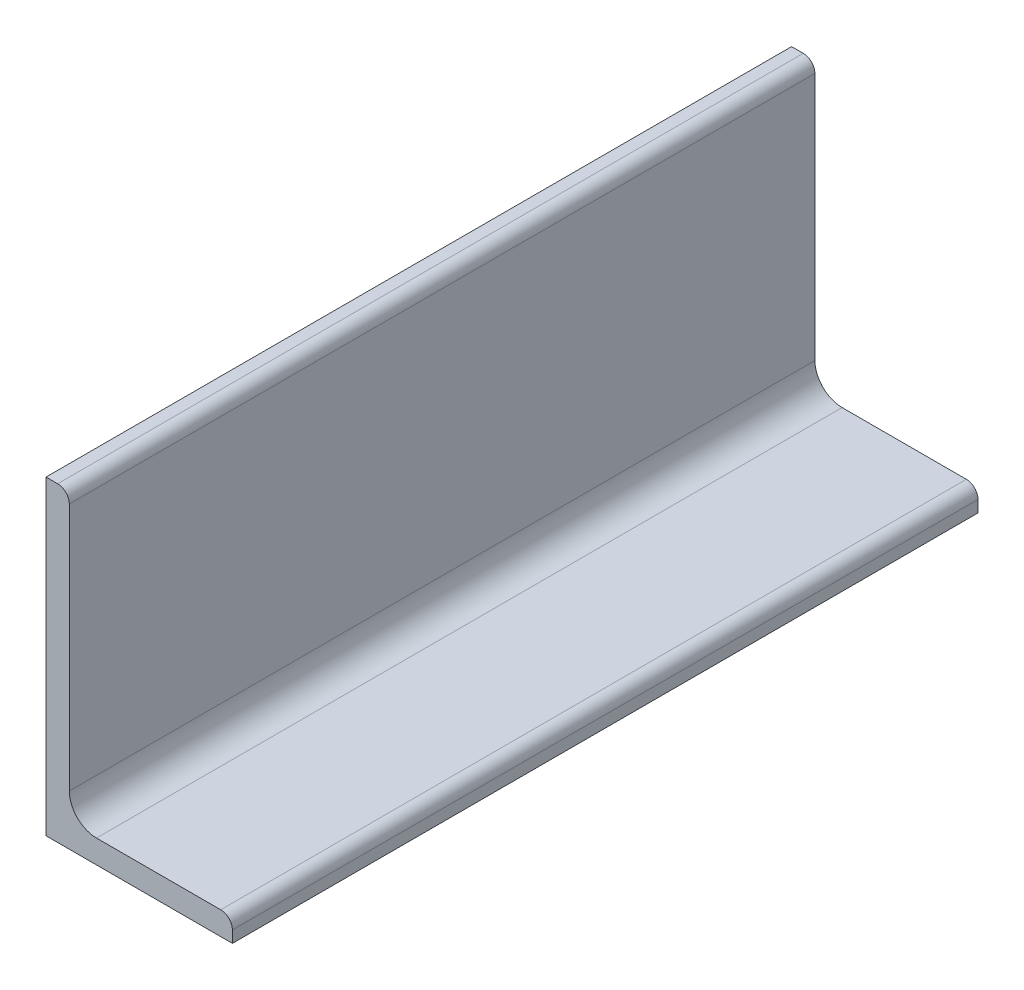
ISO-10303-21;
HEADER;
FILE_DESCRIPTION(('STEP AP214'),'2;1');
FILE_NAME('part.step','',(''),(''),'','','');
FILE_SCHEMA(('AUTOMOTIVE_DESIGN { 1 0 10303 214 1 1 1 1 }'));
ENDSEC;
DATA;
#1=APPLICATION_CONTEXT('core data for automotive mechanical design processes');
#2=APPLICATION_PROTOCOL_DEFINITION('international standard','automotive_design',2000,#1);
#3=PRODUCT_CONTEXT('',#1,'mechanical');
#4=PRODUCT('Part','Part','',(#3));
#5=PRODUCT_RELATED_PRODUCT_CATEGORY('part','',(#4));
#6=PRODUCT_DEFINITION_FORMATION('','',#4);
#7=PRODUCT_DEFINITION_CONTEXT('part definition',#1,'design');
#8=PRODUCT_DEFINITION('design','',#6,#7);
#9=PRODUCT_DEFINITION_SHAPE('','',#8);
#10=(LENGTH_UNIT() NAMED_UNIT(*) SI_UNIT(.MILLI.,.METRE.));
#11=(NAMED_UNIT(*) PLANE_ANGLE_UNIT() SI_UNIT($,.RADIAN.));
#12=(NAMED_UNIT(*) SI_UNIT($,.STERADIAN.) SOLID_ANGLE_UNIT());
#13=UNCERTAINTY_MEASURE_WITH_UNIT(LENGTH_MEASURE(1.E-05),#10,'distance_accuracy_value','');
#14=(GEOMETRIC_REPRESENTATION_CONTEXT(3) GLOBAL_UNCERTAINTY_ASSIGNED_CONTEXT((#13)) GLOBAL_UNIT_ASSIGNED_CONTEXT((#10,
#11,#12)) REPRESENTATION_CONTEXT('',''));
#15=CARTESIAN_POINT('',(0.,0.,0.));
#16=DIRECTION('',(0.,0.,1.));
#17=DIRECTION('',(1.,0.,0.));
#18=AXIS2_PLACEMENT_3D('',#15,#16,#17);
#19=CARTESIAN_POINT('',(0.490776827053332,127.041655270204,304.8));
#20=DIRECTION('',(1.,0.,0.));
#21=DIRECTION('',(0.,0.,-1.));
#22=AXIS2_PLACEMENT_3D('',#19,#20,#21);
#23=PLANE('',#22);
#24=DIRECTION('',(0.,-1.,0.));
#25=VECTOR('',#24,1.);
#26=CARTESIAN_POINT('',(0.490776827053332,127.041655270204,0.));
#27=LINE('',#26,#25);
#28=CARTESIAN_POINT('',(0.490776827053332,127.041655270204,0.));
#29=VERTEX_POINT('',#28);
#30=CARTESIAN_POINT('',(0.490776827053332,0.0416552702040917,0.));
#31=VERTEX_POINT('',#30);
#32=EDGE_CURVE('E135',#29,#31,#27,.T.);
#33=ORIENTED_EDGE('',*,*,#32,.T.);
#34=DIRECTION('',(0.,0.,-1.));
#35=VECTOR('',#34,1.);
#36=CARTESIAN_POINT('',(0.490776827053332,0.0416552702040917,304.8));
#37=LINE('',#36,#35);
#38=CARTESIAN_POINT('',(0.490776827053332,0.0416552702040917,304.8));
#39=VERTEX_POINT('',#38);
#40=EDGE_CURVE('E11',#39,#31,#37,.T.);
#41=ORIENTED_EDGE('',*,*,#40,.F.);
#42=DIRECTION('',(0.,-1.,0.));
#43=VECTOR('',#42,1.);
#44=CARTESIAN_POINT('',(0.490776827053332,127.041655270204,304.8));
#45=LINE('',#44,#43);
#46=CARTESIAN_POINT('',(0.490776827053332,127.041655270204,304.8));
#47=VERTEX_POINT('',#46);
#48=EDGE_CURVE('E151',#47,#39,#45,.T.);
#49=ORIENTED_EDGE('',*,*,#48,.F.);
#50=DIRECTION('',(0.,0.,-1.));
#51=VECTOR('',#50,1.);
#52=CARTESIAN_POINT('',(0.490776827053332,127.041655270204,304.8));
#53=LINE('',#52,#51);
#54=EDGE_CURVE('E131',#47,#29,#53,.T.);
#55=ORIENTED_EDGE('',*,*,#54,.T.);
#56=EDGE_LOOP('',(#33,#41,#49,#55));
#57=FACE_BOUND('',#56,.T.);
#58=ADVANCED_FACE('F33',(#57),#23,.F.);
#59=CARTESIAN_POINT('',(0.490776827053332,0.0416552702040917,304.8));
#60=DIRECTION('',(0.,1.,0.));
#61=DIRECTION('',(0.,0.,1.));
#62=AXIS2_PLACEMENT_3D('',#59,#60,#61);
#63=PLANE('',#62);
#64=DIRECTION('',(1.,0.,0.));
#65=VECTOR('',#64,1.);
#66=CARTESIAN_POINT('',(0.490776827053332,0.0416552702040917,0.));
#67=LINE('',#66,#65);
#68=CARTESIAN_POINT('',(76.6907768270533,0.0416552702040917,0.));
#69=VERTEX_POINT('',#68);
#70=EDGE_CURVE('E138',#31,#69,#67,.T.);
#71=ORIENTED_EDGE('',*,*,#70,.T.);
#72=DIRECTION('',(0.,0.,-1.));
#73=VECTOR('',#72,1.);
#74=CARTESIAN_POINT('',(76.6907768270533,0.0416552702040917,304.8));
#75=LINE('',#74,#73);
#76=CARTESIAN_POINT('',(76.6907768270533,0.0416552702040917,304.8));
#77=VERTEX_POINT('',#76);
#78=EDGE_CURVE('E41',#77,#69,#75,.T.);
#79=ORIENTED_EDGE('',*,*,#78,.F.);
#80=DIRECTION('',(1.,0.,0.));
#81=VECTOR('',#80,1.);
#82=CARTESIAN_POINT('',(0.490776827053332,0.0416552702040917,304.8));
#83=LINE('',#82,#81);
#84=EDGE_CURVE('E95',#39,#77,#83,.T.);
#85=ORIENTED_EDGE('',*,*,#84,.F.);
#86=ORIENTED_EDGE('',*,*,#40,.T.);
#87=EDGE_LOOP('',(#71,#79,#85,#86));
#88=FACE_BOUND('',#87,.T.);
#89=ADVANCED_FACE('F194',(#88),#63,.F.);
#90=CARTESIAN_POINT('',(76.6907768270533,0.0416552702040917,304.8));
#91=DIRECTION('',(-1.,0.,0.));
#92=DIRECTION('',(0.,0.,1.));
#93=AXIS2_PLACEMENT_3D('',#90,#91,#92);
#94=PLANE('',#93);
#95=DIRECTION('',(0.,1.,0.));
#96=VECTOR('',#95,1.);
#97=CARTESIAN_POINT('',(76.6907768270533,0.0416552702040917,0.));
#98=LINE('',#97,#96);
#99=CARTESIAN_POINT('',(76.6907768270533,4.80415527020409,0.));
#100=VERTEX_POINT('',#99);
#101=EDGE_CURVE('E140',#69,#100,#98,.T.);
#102=ORIENTED_EDGE('',*,*,#101,.T.);
#103=DIRECTION('',(0.,0.,-1.));
#104=VECTOR('',#103,1.);
#105=CARTESIAN_POINT('',(76.6907768270533,4.80415527020409,304.8));
#106=LINE('',#105,#104);
#107=CARTESIAN_POINT('',(76.6907768270533,4.80415527020409,304.8));
#108=VERTEX_POINT('',#107);
#109=EDGE_CURVE('E161',#108,#100,#106,.T.);
#110=ORIENTED_EDGE('',*,*,#109,.F.);
#111=DIRECTION('',(0.,1.,0.));
#112=VECTOR('',#111,1.);
#113=CARTESIAN_POINT('',(76.6907768270533,0.0416552702040917,304.8));
#114=LINE('',#113,#112);
#115=EDGE_CURVE('E169',#77,#108,#114,.T.);
#116=ORIENTED_EDGE('',*,*,#115,.F.);
#117=ORIENTED_EDGE('',*,*,#78,.T.);
#118=EDGE_LOOP('',(#102,#110,#116,#117));
#119=FACE_BOUND('',#118,.T.);
#120=ADVANCED_FACE('F167',(#119),#94,.F.);
#121=CARTESIAN_POINT('',(71.9282768270533,4.80415527020409,304.8));
#122=DIRECTION('',(0.,0.,-1.));
#123=DIRECTION('',(-1.,0.,0.));
#124=AXIS2_PLACEMENT_3D('',#121,#122,#123);
#125=CYLINDRICAL_SURFACE('',#124,4.7625);
#126=CARTESIAN_POINT('',(71.9282768270533,4.80415527020409,0.));
#127=DIRECTION('',(0.,0.,1.));
#128=DIRECTION('',(1.,0.,0.));
#129=AXIS2_PLACEMENT_3D('',#126,#127,#128);
#130=CIRCLE('',#129,4.7625);
#131=CARTESIAN_POINT('',(71.9282768270533,9.56665527020409,0.));
#132=VERTEX_POINT('',#131);
#133=EDGE_CURVE('E142',#100,#132,#130,.T.);
#134=ORIENTED_EDGE('',*,*,#133,.T.);
#135=DIRECTION('',(0.,0.,-1.));
#136=VECTOR('',#135,1.);
#137=CARTESIAN_POINT('',(71.9282768270533,9.56665527020409,304.8));
#138=LINE('',#137,#136);
#139=CARTESIAN_POINT('',(71.9282768270533,9.56665527020409,304.8));
#140=VERTEX_POINT('',#139);
#141=EDGE_CURVE('E158',#140,#132,#138,.T.);
#142=ORIENTED_EDGE('',*,*,#141,.F.);
#143=CARTESIAN_POINT('',(71.9282768270533,4.80415527020409,304.8));
#144=DIRECTION('',(0.,0.,1.));
#145=DIRECTION('',(1.,0.,0.));
#146=AXIS2_PLACEMENT_3D('',#143,#144,#145);
#147=CIRCLE('',#146,4.7625);
#148=EDGE_CURVE('E185',#108,#140,#147,.T.);
#149=ORIENTED_EDGE('',*,*,#148,.F.);
#150=ORIENTED_EDGE('',*,*,#109,.T.);
#151=EDGE_LOOP('',(#134,#142,#149,#150));
#152=FACE_BOUND('',#151,.T.);
#153=ADVANCED_FACE('F178',(#152),#125,.T.);
#154=CARTESIAN_POINT('',(71.9282768270533,9.56665527020409,304.8));
#155=DIRECTION('',(0.,-1.,0.));
#156=DIRECTION('',(0.,0.,-1.));
#157=AXIS2_PLACEMENT_3D('',#154,#155,#156);
#158=PLANE('',#157);
#159=DIRECTION('',(-1.,0.,0.));
#160=VECTOR('',#159,1.);
#161=CARTESIAN_POINT('',(71.9282768270533,9.56665527020409,0.));
#162=LINE('',#161,#160);
#163=CARTESIAN_POINT('',(21.1282768270533,9.56665527020409,0.));
#164=VERTEX_POINT('',#163);
#165=EDGE_CURVE('E144',#132,#164,#162,.T.);
#166=ORIENTED_EDGE('',*,*,#165,.T.);
#167=DIRECTION('',(0.,0.,-1.));
#168=VECTOR('',#167,1.);
#169=CARTESIAN_POINT('',(21.1282768270533,9.56665527020409,304.8));
#170=LINE('',#169,#168);
#171=CARTESIAN_POINT('',(21.1282768270533,9.56665527020409,304.8));
#172=VERTEX_POINT('',#171);
#173=EDGE_CURVE('E155',#172,#164,#170,.T.);
#174=ORIENTED_EDGE('',*,*,#173,.F.);
#175=DIRECTION('',(-1.,0.,0.));
#176=VECTOR('',#175,1.);
#177=CARTESIAN_POINT('',(71.9282768270533,9.56665527020409,304.8));
#178=LINE('',#177,#176);
#179=EDGE_CURVE('E184',#140,#172,#178,.T.);
#180=ORIENTED_EDGE('',*,*,#179,.F.);
#181=ORIENTED_EDGE('',*,*,#141,.T.);
#182=EDGE_LOOP('',(#166,#174,#180,#181));
#183=FACE_BOUND('',#182,.T.);
#184=ADVANCED_FACE('F182',(#183),#158,.F.);
#185=CARTESIAN_POINT('',(21.1282768270533,20.6791552702041,304.8));
#186=DIRECTION('',(0.,0.,-1.));
#187=DIRECTION('',(-1.,0.,0.));
#188=AXIS2_PLACEMENT_3D('',#185,#186,#187);
#189=CYLINDRICAL_SURFACE('',#188,11.1125);
#190=CARTESIAN_POINT('',(21.1282768270533,20.6791552702041,0.));
#191=DIRECTION('',(0.,0.,-1.));
#192=DIRECTION('',(1.,0.,0.));
#193=AXIS2_PLACEMENT_3D('',#190,#191,#192);
#194=CIRCLE('',#193,11.1125);
#195=CARTESIAN_POINT('',(10.0157768270533,20.6791552702041,0.));
#196=VERTEX_POINT('',#195);
#197=EDGE_CURVE('E146',#164,#196,#194,.T.);
#198=ORIENTED_EDGE('',*,*,#197,.T.);
#199=DIRECTION('',(0.,0.,-1.));
#200=VECTOR('',#199,1.);
#201=CARTESIAN_POINT('',(10.0157768270533,20.6791552702041,304.8));
#202=LINE('',#201,#200);
#203=CARTESIAN_POINT('',(10.0157768270533,20.6791552702041,304.8));
#204=VERTEX_POINT('',#203);
#205=EDGE_CURVE('E126',#204,#196,#202,.T.);
#206=ORIENTED_EDGE('',*,*,#205,.F.);
#207=CARTESIAN_POINT('',(21.1282768270533,20.6791552702041,304.8));
#208=DIRECTION('',(0.,0.,-1.));
#209=DIRECTION('',(1.,0.,0.));
#210=AXIS2_PLACEMENT_3D('',#207,#208,#209);
#211=CIRCLE('',#210,11.1125);
#212=EDGE_CURVE('E117',#172,#204,#211,.T.);
#213=ORIENTED_EDGE('',*,*,#212,.F.);
#214=ORIENTED_EDGE('',*,*,#173,.T.);
#215=EDGE_LOOP('',(#198,#206,#213,#214));
#216=FACE_BOUND('',#215,.T.);
#217=ADVANCED_FACE('F206',(#216),#189,.F.);
#218=CARTESIAN_POINT('',(10.0157768270533,20.6791552702041,304.8));
#219=DIRECTION('',(-1.,0.,0.));
#220=DIRECTION('',(0.,0.,1.));
#221=AXIS2_PLACEMENT_3D('',#218,#219,#220);
#222=PLANE('',#221);
#223=DIRECTION('',(0.,1.,0.));
#224=VECTOR('',#223,1.);
#225=CARTESIAN_POINT('',(10.0157768270533,20.6791552702041,0.));
#226=LINE('',#225,#224);
#227=CARTESIAN_POINT('',(10.0157768270533,122.279155270204,0.));
#228=VERTEX_POINT('',#227);
#229=EDGE_CURVE('E125',#196,#228,#226,.T.);
#230=ORIENTED_EDGE('',*,*,#229,.T.);
#231=DIRECTION('',(0.,0.,-1.));
#232=VECTOR('',#231,1.);
#233=CARTESIAN_POINT('',(10.0157768270533,122.279155270204,304.8));
#234=LINE('',#233,#232);
#235=CARTESIAN_POINT('',(10.0157768270533,122.279155270204,304.8));
#236=VERTEX_POINT('',#235);
#237=EDGE_CURVE('E122',#236,#228,#234,.T.);
#238=ORIENTED_EDGE('',*,*,#237,.F.);
#239=DIRECTION('',(0.,1.,0.));
#240=VECTOR('',#239,1.);
#241=CARTESIAN_POINT('',(10.0157768270533,20.6791552702041,304.8));
#242=LINE('',#241,#240);
#243=EDGE_CURVE('E111',#204,#236,#242,.T.);
#244=ORIENTED_EDGE('',*,*,#243,.F.);
#245=ORIENTED_EDGE('',*,*,#205,.T.);
#246=EDGE_LOOP('',(#230,#238,#244,#245));
#247=FACE_BOUND('',#246,.T.);
#248=ADVANCED_FACE('F123',(#247),#222,.F.);
#249=CARTESIAN_POINT('',(5.25327682705334,122.279155270204,304.8));
#250=DIRECTION('',(0.,0.,-1.));
#251=DIRECTION('',(-1.,0.,0.));
#252=AXIS2_PLACEMENT_3D('',#249,#250,#251);
#253=CYLINDRICAL_SURFACE('',#252,4.7625);
#254=CARTESIAN_POINT('',(5.25327682705334,122.279155270204,0.));
#255=DIRECTION('',(0.,0.,1.));
#256=DIRECTION('',(1.,0.,0.));
#257=AXIS2_PLACEMENT_3D('',#254,#255,#256);
#258=CIRCLE('',#257,4.7625);
#259=CARTESIAN_POINT('',(5.25327682705333,127.041655270204,0.));
#260=VERTEX_POINT('',#259);
#261=EDGE_CURVE('E81',#228,#260,#258,.T.);
#262=ORIENTED_EDGE('',*,*,#261,.T.);
#263=DIRECTION('',(0.,0.,-1.));
#264=VECTOR('',#263,1.);
#265=CARTESIAN_POINT('',(5.25327682705333,127.041655270204,304.8));
#266=LINE('',#265,#264);
#267=CARTESIAN_POINT('',(5.25327682705333,127.041655270204,304.8));
#268=VERTEX_POINT('',#267);
#269=EDGE_CURVE('E127',#268,#260,#266,.T.);
#270=ORIENTED_EDGE('',*,*,#269,.F.);
#271=CARTESIAN_POINT('',(5.25327682705334,122.279155270204,304.8));
#272=DIRECTION('',(0.,0.,1.));
#273=DIRECTION('',(1.,0.,0.));
#274=AXIS2_PLACEMENT_3D('',#271,#272,#273);
#275=CIRCLE('',#274,4.7625);
#276=EDGE_CURVE('E115',#236,#268,#275,.T.);
#277=ORIENTED_EDGE('',*,*,#276,.F.);
#278=ORIENTED_EDGE('',*,*,#237,.T.);
#279=EDGE_LOOP('',(#262,#270,#277,#278));
#280=FACE_BOUND('',#279,.T.);
#281=ADVANCED_FACE('F129',(#280),#253,.T.);
#282=CARTESIAN_POINT('',(5.25327682705333,127.041655270204,304.8));
#283=DIRECTION('',(0.,-1.,0.));
#284=DIRECTION('',(0.,0.,-1.));
#285=AXIS2_PLACEMENT_3D('',#282,#283,#284);
#286=PLANE('',#285);
#287=DIRECTION('',(-1.,0.,0.));
#288=VECTOR('',#287,1.);
#289=CARTESIAN_POINT('',(5.25327682705333,127.041655270204,0.));
#290=LINE('',#289,#288);
#291=EDGE_CURVE('E87',#260,#29,#290,.T.);
#292=ORIENTED_EDGE('',*,*,#291,.T.);
#293=ORIENTED_EDGE('',*,*,#54,.F.);
#294=DIRECTION('',(-1.,0.,0.));
#295=VECTOR('',#294,1.);
#296=CARTESIAN_POINT('',(5.25327682705333,127.041655270204,304.8));
#297=LINE('',#296,#295);
#298=EDGE_CURVE('E49',#268,#47,#297,.T.);
#299=ORIENTED_EDGE('',*,*,#298,.F.);
#300=ORIENTED_EDGE('',*,*,#269,.T.);
#301=EDGE_LOOP('',(#292,#293,#299,#300));
#302=FACE_BOUND('',#301,.T.);
#303=ADVANCED_FACE('F214',(#302),#286,.F.);
#304=CARTESIAN_POINT('',(71.9282768270533,4.80415527020409,304.8));
#305=DIRECTION('',(0.,0.,1.));
#306=DIRECTION('',(1.,0.,0.));
#307=AXIS2_PLACEMENT_3D('',#304,#305,#306);
#308=PLANE('',#307);
#309=ORIENTED_EDGE('',*,*,#48,.T.);
#310=ORIENTED_EDGE('',*,*,#84,.T.);
#311=ORIENTED_EDGE('',*,*,#115,.T.);
#312=ORIENTED_EDGE('',*,*,#148,.T.);
#313=ORIENTED_EDGE('',*,*,#179,.T.);
#314=ORIENTED_EDGE('',*,*,#212,.T.);
#315=ORIENTED_EDGE('',*,*,#243,.T.);
#316=ORIENTED_EDGE('',*,*,#276,.T.);
#317=ORIENTED_EDGE('',*,*,#298,.T.);
#318=EDGE_LOOP('',(#309,#310,#311,#312,#313,#314,#315,#316,#317));
#319=FACE_BOUND('',#318,.T.);
#320=ADVANCED_FACE('F113',(#319),#308,.T.);
#321=CARTESIAN_POINT('',(71.9282768270533,4.80415527020409,0.));
#322=DIRECTION('',(0.,0.,1.));
#323=DIRECTION('',(1.,0.,0.));
#324=AXIS2_PLACEMENT_3D('',#321,#322,#323);
#325=PLANE('',#324);
#326=ORIENTED_EDGE('',*,*,#32,.F.);
#327=ORIENTED_EDGE('',*,*,#291,.F.);
#328=ORIENTED_EDGE('',*,*,#261,.F.);
#329=ORIENTED_EDGE('',*,*,#229,.F.);
#330=ORIENTED_EDGE('',*,*,#197,.F.);
#331=ORIENTED_EDGE('',*,*,#165,.F.);
#332=ORIENTED_EDGE('',*,*,#133,.F.);
#333=ORIENTED_EDGE('',*,*,#101,.F.);
#334=ORIENTED_EDGE('',*,*,#70,.F.);
#335=EDGE_LOOP('',(#326,#327,#328,#329,#330,#331,#332,#333,#334));
#336=FACE_BOUND('',#335,.T.);
#337=ADVANCED_FACE('F173',(#336),#325,.F.);
#338=CLOSED_SHELL('',(#58,#89,#120,#153,#184,#217,#248,#281,#303,#320,#337));
#339=MANIFOLD_SOLID_BREP('B2',#338);
#340=ADVANCED_BREP_SHAPE_REPRESENTATION('',(#18,#339),#14);
#341=SHAPE_DEFINITION_REPRESENTATION(#9,#340);
ENDSEC;
END-ISO-10303-21;
